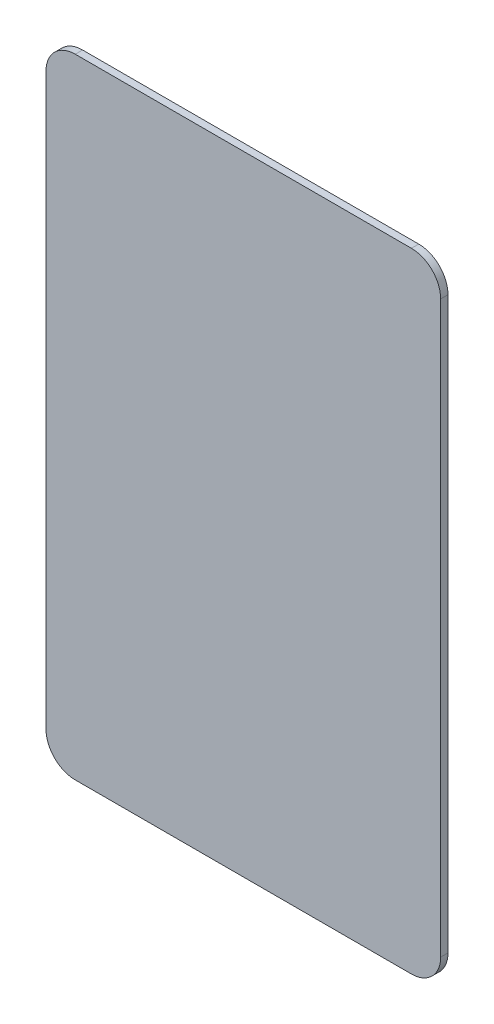
ISO-10303-21;
HEADER;
FILE_DESCRIPTION(('STEP AP214'),'2;1');
FILE_NAME('part.step','',(''),(''),'','','');
FILE_SCHEMA(('AUTOMOTIVE_DESIGN { 1 0 10303 214 1 1 1 1 }'));
ENDSEC;
DATA;
#1=APPLICATION_CONTEXT('core data for automotive mechanical design processes');
#2=APPLICATION_PROTOCOL_DEFINITION('international standard','automotive_design',2000,#1);
#3=PRODUCT_CONTEXT('',#1,'mechanical');
#4=PRODUCT('Part','Part','',(#3));
#5=PRODUCT_RELATED_PRODUCT_CATEGORY('part','',(#4));
#6=PRODUCT_DEFINITION_FORMATION('','',#4);
#7=PRODUCT_DEFINITION_CONTEXT('part definition',#1,'design');
#8=PRODUCT_DEFINITION('design','',#6,#7);
#9=PRODUCT_DEFINITION_SHAPE('','',#8);
#10=(LENGTH_UNIT() NAMED_UNIT(*) SI_UNIT(.MILLI.,.METRE.));
#11=(NAMED_UNIT(*) PLANE_ANGLE_UNIT() SI_UNIT($,.RADIAN.));
#12=(NAMED_UNIT(*) SI_UNIT($,.STERADIAN.) SOLID_ANGLE_UNIT());
#13=UNCERTAINTY_MEASURE_WITH_UNIT(LENGTH_MEASURE(1.E-05),#10,'distance_accuracy_value','');
#14=(GEOMETRIC_REPRESENTATION_CONTEXT(3) GLOBAL_UNCERTAINTY_ASSIGNED_CONTEXT((#13)) GLOBAL_UNIT_ASSIGNED_CONTEXT((#10,
#11,#12)) REPRESENTATION_CONTEXT('',''));
#15=CARTESIAN_POINT('',(0.,0.,0.));
#16=DIRECTION('',(0.,0.,1.));
#17=DIRECTION('',(1.,0.,0.));
#18=AXIS2_PLACEMENT_3D('',#15,#16,#17);
#19=CARTESIAN_POINT('',(27.,-43.,1.));
#20=DIRECTION('',(-1.,0.,0.));
#21=DIRECTION('',(0.,0.,1.));
#22=AXIS2_PLACEMENT_3D('',#19,#20,#21);
#23=PLANE('',#22);
#24=DIRECTION('',(0.,1.,0.));
#25=VECTOR('',#24,1.);
#26=CARTESIAN_POINT('',(27.,-43.,1.));
#27=LINE('',#26,#25);
#28=CARTESIAN_POINT('',(27.,-39.,1.));
#29=VERTEX_POINT('',#28);
#30=CARTESIAN_POINT('',(27.,39.,1.));
#31=VERTEX_POINT('',#30);
#32=EDGE_CURVE('E125',#29,#31,#27,.T.);
#33=ORIENTED_EDGE('',*,*,#32,.F.);
#34=DIRECTION('',(0.,0.,-1.));
#35=VECTOR('',#34,1.);
#36=CARTESIAN_POINT('',(27.,-39.,1.));
#37=LINE('',#36,#35);
#38=CARTESIAN_POINT('',(27.,-39.,0.));
#39=VERTEX_POINT('',#38);
#40=EDGE_CURVE('E151',#29,#39,#37,.T.);
#41=ORIENTED_EDGE('',*,*,#40,.T.);
#42=DIRECTION('',(0.,1.,0.));
#43=VECTOR('',#42,1.);
#44=CARTESIAN_POINT('',(27.,-43.,0.));
#45=LINE('',#44,#43);
#46=CARTESIAN_POINT('',(27.,39.,0.));
#47=VERTEX_POINT('',#46);
#48=EDGE_CURVE('E157',#39,#47,#45,.T.);
#49=ORIENTED_EDGE('',*,*,#48,.T.);
#50=DIRECTION('',(0.,0.,-1.));
#51=VECTOR('',#50,1.);
#52=CARTESIAN_POINT('',(27.,39.,1.));
#53=LINE('',#52,#51);
#54=EDGE_CURVE('E149',#47,#31,#53,.F.);
#55=ORIENTED_EDGE('',*,*,#54,.T.);
#56=EDGE_LOOP('',(#33,#41,#49,#55));
#57=FACE_BOUND('',#56,.T.);
#58=ADVANCED_FACE('F33',(#57),#23,.F.);
#59=CARTESIAN_POINT('',(-27.,43.,1.));
#60=DIRECTION('',(0.,-1.,0.));
#61=DIRECTION('',(0.,0.,-1.));
#62=AXIS2_PLACEMENT_3D('',#59,#60,#61);
#63=PLANE('',#62);
#64=DIRECTION('',(-1.,0.,0.));
#65=VECTOR('',#64,1.);
#66=CARTESIAN_POINT('',(-27.,43.,1.));
#67=LINE('',#66,#65);
#68=CARTESIAN_POINT('',(23.,43.,1.));
#69=VERTEX_POINT('',#68);
#70=CARTESIAN_POINT('',(-23.,43.,1.));
#71=VERTEX_POINT('',#70);
#72=EDGE_CURVE('E128',#69,#71,#67,.T.);
#73=ORIENTED_EDGE('',*,*,#72,.F.);
#74=DIRECTION('',(0.,0.,-1.));
#75=VECTOR('',#74,1.);
#76=CARTESIAN_POINT('',(23.,43.,1.));
#77=LINE('',#76,#75);
#78=CARTESIAN_POINT('',(23.,43.,0.));
#79=VERTEX_POINT('',#78);
#80=EDGE_CURVE('E11',#69,#79,#77,.T.);
#81=ORIENTED_EDGE('',*,*,#80,.T.);
#82=DIRECTION('',(-1.,0.,0.));
#83=VECTOR('',#82,1.);
#84=CARTESIAN_POINT('',(-27.,43.,0.));
#85=LINE('',#84,#83);
#86=CARTESIAN_POINT('',(-23.,43.,0.));
#87=VERTEX_POINT('',#86);
#88=EDGE_CURVE('E130',#79,#87,#85,.T.);
#89=ORIENTED_EDGE('',*,*,#88,.T.);
#90=DIRECTION('',(0.,0.,-1.));
#91=VECTOR('',#90,1.);
#92=CARTESIAN_POINT('',(-23.,43.,1.));
#93=LINE('',#92,#91);
#94=EDGE_CURVE('E41',#87,#71,#93,.F.);
#95=ORIENTED_EDGE('',*,*,#94,.T.);
#96=EDGE_LOOP('',(#73,#81,#89,#95));
#97=FACE_BOUND('',#96,.T.);
#98=ADVANCED_FACE('F176',(#97),#63,.F.);
#99=CARTESIAN_POINT('',(-27.,-43.,1.));
#100=DIRECTION('',(1.,0.,0.));
#101=DIRECTION('',(0.,0.,-1.));
#102=AXIS2_PLACEMENT_3D('',#99,#100,#101);
#103=PLANE('',#102);
#104=DIRECTION('',(0.,-1.,0.));
#105=VECTOR('',#104,1.);
#106=CARTESIAN_POINT('',(-27.,-43.,0.));
#107=LINE('',#106,#105);
#108=CARTESIAN_POINT('',(-27.,39.,0.));
#109=VERTEX_POINT('',#108);
#110=CARTESIAN_POINT('',(-27.,-39.,0.));
#111=VERTEX_POINT('',#110);
#112=EDGE_CURVE('E126',#109,#111,#107,.T.);
#113=ORIENTED_EDGE('',*,*,#112,.T.);
#114=DIRECTION('',(0.,0.,-1.));
#115=VECTOR('',#114,1.);
#116=CARTESIAN_POINT('',(-27.,-39.,1.));
#117=LINE('',#116,#115);
#118=CARTESIAN_POINT('',(-27.,-39.,1.));
#119=VERTEX_POINT('',#118);
#120=EDGE_CURVE('E104',#111,#119,#117,.F.);
#121=ORIENTED_EDGE('',*,*,#120,.T.);
#122=DIRECTION('',(0.,-1.,0.));
#123=VECTOR('',#122,1.);
#124=CARTESIAN_POINT('',(-27.,-43.,1.));
#125=LINE('',#124,#123);
#126=CARTESIAN_POINT('',(-27.,39.,1.));
#127=VERTEX_POINT('',#126);
#128=EDGE_CURVE('E165',#127,#119,#125,.T.);
#129=ORIENTED_EDGE('',*,*,#128,.F.);
#130=DIRECTION('',(0.,0.,-1.));
#131=VECTOR('',#130,1.);
#132=CARTESIAN_POINT('',(-27.,39.,1.));
#133=LINE('',#132,#131);
#134=EDGE_CURVE('E109',#127,#109,#133,.T.);
#135=ORIENTED_EDGE('',*,*,#134,.T.);
#136=EDGE_LOOP('',(#113,#121,#129,#135));
#137=FACE_BOUND('',#136,.T.);
#138=ADVANCED_FACE('F175',(#137),#103,.F.);
#139=CARTESIAN_POINT('',(-27.,-43.,1.));
#140=DIRECTION('',(0.,1.,0.));
#141=DIRECTION('',(0.,0.,1.));
#142=AXIS2_PLACEMENT_3D('',#139,#140,#141);
#143=PLANE('',#142);
#144=DIRECTION('',(1.,0.,0.));
#145=VECTOR('',#144,1.);
#146=CARTESIAN_POINT('',(-27.,-43.,1.));
#147=LINE('',#146,#145);
#148=CARTESIAN_POINT('',(-23.,-43.,1.));
#149=VERTEX_POINT('',#148);
#150=CARTESIAN_POINT('',(23.,-43.,1.));
#151=VERTEX_POINT('',#150);
#152=EDGE_CURVE('E119',#149,#151,#147,.T.);
#153=ORIENTED_EDGE('',*,*,#152,.F.);
#154=DIRECTION('',(0.,0.,-1.));
#155=VECTOR('',#154,1.);
#156=CARTESIAN_POINT('',(-23.,-43.,1.));
#157=LINE('',#156,#155);
#158=CARTESIAN_POINT('',(-23.,-43.,0.));
#159=VERTEX_POINT('',#158);
#160=EDGE_CURVE('E103',#149,#159,#157,.T.);
#161=ORIENTED_EDGE('',*,*,#160,.T.);
#162=DIRECTION('',(1.,0.,0.));
#163=VECTOR('',#162,1.);
#164=CARTESIAN_POINT('',(-27.,-43.,0.));
#165=LINE('',#164,#163);
#166=CARTESIAN_POINT('',(23.,-43.,0.));
#167=VERTEX_POINT('',#166);
#168=EDGE_CURVE('E116',#159,#167,#165,.T.);
#169=ORIENTED_EDGE('',*,*,#168,.T.);
#170=DIRECTION('',(0.,0.,-1.));
#171=VECTOR('',#170,1.);
#172=CARTESIAN_POINT('',(23.,-43.,1.));
#173=LINE('',#172,#171);
#174=EDGE_CURVE('E121',#167,#151,#173,.F.);
#175=ORIENTED_EDGE('',*,*,#174,.T.);
#176=EDGE_LOOP('',(#153,#161,#169,#175));
#177=FACE_BOUND('',#176,.T.);
#178=ADVANCED_FACE('F115',(#177),#143,.F.);
#179=CARTESIAN_POINT('',(0.,0.,1.));
#180=DIRECTION('',(0.,0.,-1.));
#181=DIRECTION('',(-1.,0.,0.));
#182=AXIS2_PLACEMENT_3D('',#179,#180,#181);
#183=PLANE('',#182);
#184=ORIENTED_EDGE('',*,*,#128,.T.);
#185=CARTESIAN_POINT('',(-23.,-39.,1.));
#186=DIRECTION('',(0.,0.,-1.));
#187=DIRECTION('',(-1.,0.,0.));
#188=AXIS2_PLACEMENT_3D('',#185,#186,#187);
#189=CIRCLE('',#188,4.);
#190=EDGE_CURVE('E147',#119,#149,#189,.F.);
#191=ORIENTED_EDGE('',*,*,#190,.T.);
#192=ORIENTED_EDGE('',*,*,#152,.T.);
#193=CARTESIAN_POINT('',(23.,-39.,1.));
#194=DIRECTION('',(0.,0.,-1.));
#195=DIRECTION('',(-1.,0.,0.));
#196=AXIS2_PLACEMENT_3D('',#193,#194,#195);
#197=CIRCLE('',#196,4.);
#198=EDGE_CURVE('E145',#151,#29,#197,.F.);
#199=ORIENTED_EDGE('',*,*,#198,.T.);
#200=ORIENTED_EDGE('',*,*,#32,.T.);
#201=CARTESIAN_POINT('',(23.,39.,1.));
#202=DIRECTION('',(0.,0.,-1.));
#203=DIRECTION('',(-1.,0.,0.));
#204=AXIS2_PLACEMENT_3D('',#201,#202,#203);
#205=CIRCLE('',#204,4.);
#206=EDGE_CURVE('E54',#31,#69,#205,.F.);
#207=ORIENTED_EDGE('',*,*,#206,.T.);
#208=ORIENTED_EDGE('',*,*,#72,.T.);
#209=CARTESIAN_POINT('',(-23.,39.,1.));
#210=DIRECTION('',(0.,0.,-1.));
#211=DIRECTION('',(-1.,0.,0.));
#212=AXIS2_PLACEMENT_3D('',#209,#210,#211);
#213=CIRCLE('',#212,4.);
#214=EDGE_CURVE('E142',#71,#127,#213,.F.);
#215=ORIENTED_EDGE('',*,*,#214,.T.);
#216=EDGE_LOOP('',(#184,#191,#192,#199,#200,#207,#208,#215));
#217=FACE_BOUND('',#216,.T.);
#218=ADVANCED_FACE('F169',(#217),#183,.F.);
#219=CARTESIAN_POINT('',(0.,0.,0.));
#220=DIRECTION('',(0.,0.,-1.));
#221=DIRECTION('',(-1.,0.,0.));
#222=AXIS2_PLACEMENT_3D('',#219,#220,#221);
#223=PLANE('',#222);
#224=ORIENTED_EDGE('',*,*,#168,.F.);
#225=CARTESIAN_POINT('',(-23.,-39.,0.));
#226=DIRECTION('',(0.,0.,-1.));
#227=DIRECTION('',(-1.,0.,0.));
#228=AXIS2_PLACEMENT_3D('',#225,#226,#227);
#229=CIRCLE('',#228,4.);
#230=EDGE_CURVE('E99',#159,#111,#229,.T.);
#231=ORIENTED_EDGE('',*,*,#230,.T.);
#232=ORIENTED_EDGE('',*,*,#112,.F.);
#233=CARTESIAN_POINT('',(-23.,39.,0.));
#234=DIRECTION('',(0.,0.,-1.));
#235=DIRECTION('',(-1.,0.,0.));
#236=AXIS2_PLACEMENT_3D('',#233,#234,#235);
#237=CIRCLE('',#236,4.);
#238=EDGE_CURVE('E120',#109,#87,#237,.T.);
#239=ORIENTED_EDGE('',*,*,#238,.T.);
#240=ORIENTED_EDGE('',*,*,#88,.F.);
#241=CARTESIAN_POINT('',(23.,39.,0.));
#242=DIRECTION('',(0.,0.,-1.));
#243=DIRECTION('',(-1.,0.,0.));
#244=AXIS2_PLACEMENT_3D('',#241,#242,#243);
#245=CIRCLE('',#244,4.);
#246=EDGE_CURVE('E136',#79,#47,#245,.T.);
#247=ORIENTED_EDGE('',*,*,#246,.T.);
#248=ORIENTED_EDGE('',*,*,#48,.F.);
#249=CARTESIAN_POINT('',(23.,-39.,0.));
#250=DIRECTION('',(0.,0.,-1.));
#251=DIRECTION('',(-1.,0.,0.));
#252=AXIS2_PLACEMENT_3D('',#249,#250,#251);
#253=CIRCLE('',#252,4.);
#254=EDGE_CURVE('E110',#39,#167,#253,.T.);
#255=ORIENTED_EDGE('',*,*,#254,.T.);
#256=EDGE_LOOP('',(#224,#231,#232,#239,#240,#247,#248,#255));
#257=FACE_BOUND('',#256,.T.);
#258=ADVANCED_FACE('F123',(#257),#223,.T.);
#259=CARTESIAN_POINT('',(-23.,-39.,1.));
#260=DIRECTION('',(0.,0.,-1.));
#261=DIRECTION('',(-1.,0.,0.));
#262=AXIS2_PLACEMENT_3D('',#259,#260,#261);
#263=CYLINDRICAL_SURFACE('',#262,4.);
#264=ORIENTED_EDGE('',*,*,#190,.F.);
#265=ORIENTED_EDGE('',*,*,#120,.F.);
#266=ORIENTED_EDGE('',*,*,#230,.F.);
#267=ORIENTED_EDGE('',*,*,#160,.F.);
#268=EDGE_LOOP('',(#264,#265,#266,#267));
#269=FACE_BOUND('',#268,.T.);
#270=ADVANCED_FACE('F102',(#269),#263,.T.);
#271=CARTESIAN_POINT('',(23.,-39.,1.));
#272=DIRECTION('',(0.,0.,-1.));
#273=DIRECTION('',(-1.,0.,0.));
#274=AXIS2_PLACEMENT_3D('',#271,#272,#273);
#275=CYLINDRICAL_SURFACE('',#274,4.);
#276=ORIENTED_EDGE('',*,*,#198,.F.);
#277=ORIENTED_EDGE('',*,*,#174,.F.);
#278=ORIENTED_EDGE('',*,*,#254,.F.);
#279=ORIENTED_EDGE('',*,*,#40,.F.);
#280=EDGE_LOOP('',(#276,#277,#278,#279));
#281=FACE_BOUND('',#280,.T.);
#282=ADVANCED_FACE('F179',(#281),#275,.T.);
#283=CARTESIAN_POINT('',(23.,39.,1.));
#284=DIRECTION('',(0.,0.,-1.));
#285=DIRECTION('',(-1.,0.,0.));
#286=AXIS2_PLACEMENT_3D('',#283,#284,#285);
#287=CYLINDRICAL_SURFACE('',#286,4.);
#288=ORIENTED_EDGE('',*,*,#206,.F.);
#289=ORIENTED_EDGE('',*,*,#54,.F.);
#290=ORIENTED_EDGE('',*,*,#246,.F.);
#291=ORIENTED_EDGE('',*,*,#80,.F.);
#292=EDGE_LOOP('',(#288,#289,#290,#291));
#293=FACE_BOUND('',#292,.T.);
#294=ADVANCED_FACE('F178',(#293),#287,.T.);
#295=CARTESIAN_POINT('',(-23.,39.,1.));
#296=DIRECTION('',(0.,0.,-1.));
#297=DIRECTION('',(-1.,0.,0.));
#298=AXIS2_PLACEMENT_3D('',#295,#296,#297);
#299=CYLINDRICAL_SURFACE('',#298,4.);
#300=ORIENTED_EDGE('',*,*,#214,.F.);
#301=ORIENTED_EDGE('',*,*,#94,.F.);
#302=ORIENTED_EDGE('',*,*,#238,.F.);
#303=ORIENTED_EDGE('',*,*,#134,.F.);
#304=EDGE_LOOP('',(#300,#301,#302,#303));
#305=FACE_BOUND('',#304,.T.);
#306=ADVANCED_FACE('F35',(#305),#299,.T.);
#307=CLOSED_SHELL('',(#58,#98,#138,#178,#218,#258,#270,#282,#294,#306));
#308=MANIFOLD_SOLID_BREP('B2',#307);
#309=ADVANCED_BREP_SHAPE_REPRESENTATION('',(#18,#308),#14);
#310=SHAPE_DEFINITION_REPRESENTATION(#9,#309);
ENDSEC;
END-ISO-10303-21;
